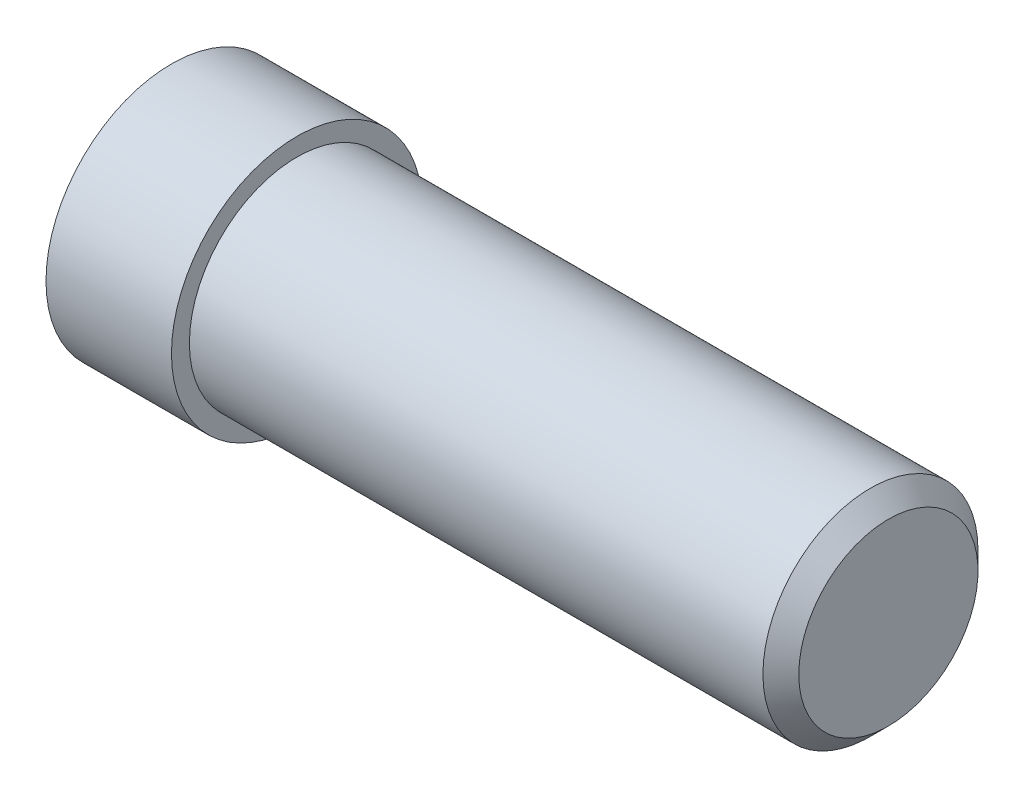
ISO-10303-21;
HEADER;
FILE_DESCRIPTION(('STEP AP214'),'2;1');
FILE_NAME('part.step','',(''),(''),'','','');
FILE_SCHEMA(('AUTOMOTIVE_DESIGN { 1 0 10303 214 1 1 1 1 }'));
ENDSEC;
DATA;
#1=APPLICATION_CONTEXT('core data for automotive mechanical design processes');
#2=APPLICATION_PROTOCOL_DEFINITION('international standard','automotive_design',2000,#1);
#3=PRODUCT_CONTEXT('',#1,'mechanical');
#4=PRODUCT('Part','Part','',(#3));
#5=PRODUCT_RELATED_PRODUCT_CATEGORY('part','',(#4));
#6=PRODUCT_DEFINITION_FORMATION('','',#4);
#7=PRODUCT_DEFINITION_CONTEXT('part definition',#1,'design');
#8=PRODUCT_DEFINITION('design','',#6,#7);
#9=PRODUCT_DEFINITION_SHAPE('','',#8);
#10=(LENGTH_UNIT() NAMED_UNIT(*) SI_UNIT(.MILLI.,.METRE.));
#11=(NAMED_UNIT(*) PLANE_ANGLE_UNIT() SI_UNIT($,.RADIAN.));
#12=(NAMED_UNIT(*) SI_UNIT($,.STERADIAN.) SOLID_ANGLE_UNIT());
#13=UNCERTAINTY_MEASURE_WITH_UNIT(LENGTH_MEASURE(1.E-05),#10,'distance_accuracy_value','');
#14=(GEOMETRIC_REPRESENTATION_CONTEXT(3) GLOBAL_UNCERTAINTY_ASSIGNED_CONTEXT((#13)) GLOBAL_UNIT_ASSIGNED_CONTEXT((#10,
#11,#12)) REPRESENTATION_CONTEXT('',''));
#15=CARTESIAN_POINT('',(0.,0.,0.));
#16=DIRECTION('',(0.,0.,1.));
#17=DIRECTION('',(1.,0.,0.));
#18=AXIS2_PLACEMENT_3D('',#15,#16,#17);
#19=CARTESIAN_POINT('',(-39.0080375692254,25.9128010675254,0.));
#20=DIRECTION('',(-1.,0.,0.));
#21=DIRECTION('',(0.,0.,1.));
#22=AXIS2_PLACEMENT_3D('',#19,#20,#21);
#23=PLANE('',#22);
#24=CARTESIAN_POINT('',(-39.0080375692254,20.1101694915254,0.));
#25=DIRECTION('',(-1.,0.,0.));
#26=DIRECTION('',(0.,0.,1.));
#27=AXIS2_PLACEMENT_3D('',#24,#25,#26);
#28=CIRCLE('',#27,5.802631576);
#29=CARTESIAN_POINT('',(-39.0080375692254,20.1101694915254,5.802631576));
#30=VERTEX_POINT('',#29);
#31=EDGE_CURVE('E51',#30,#30,#28,.T.);
#32=ORIENTED_EDGE('',*,*,#31,.F.);
#33=EDGE_LOOP('',(#32));
#34=FACE_BOUND('',#33,.T.);
#35=CARTESIAN_POINT('',(-39.0080375692254,20.1101694915254,0.));
#36=DIRECTION('',(-1.,0.,0.));
#37=DIRECTION('',(0.,0.,1.));
#38=AXIS2_PLACEMENT_3D('',#35,#36,#37);
#39=CIRCLE('',#38,4.973684208);
#40=CARTESIAN_POINT('',(-39.0080375692254,20.1101694915254,4.973684208));
#41=VERTEX_POINT('',#40);
#42=EDGE_CURVE('E60',#41,#41,#39,.T.);
#43=ORIENTED_EDGE('',*,*,#42,.T.);
#44=EDGE_LOOP('',(#43));
#45=FACE_BOUND('',#44,.T.);
#46=ADVANCED_FACE('F40',(#34,#45),#23,.F.);
#47=CARTESIAN_POINT('',(-45.4991169593271,20.1101694915254,0.));
#48=DIRECTION('',(-1.,0.,0.));
#49=DIRECTION('',(0.,0.,1.));
#50=AXIS2_PLACEMENT_3D('',#47,#48,#49);
#51=CYLINDRICAL_SURFACE('',#50,5.802631576);
#52=CARTESIAN_POINT('',(-44.8106691452254,20.1101694915254,0.));
#53=DIRECTION('',(-1.,0.,0.));
#54=DIRECTION('',(0.,0.,1.));
#55=AXIS2_PLACEMENT_3D('',#52,#53,#54);
#56=CIRCLE('',#55,5.802631576);
#57=CARTESIAN_POINT('',(-44.8106691452254,20.1101694915254,5.802631576));
#58=VERTEX_POINT('',#57);
#59=EDGE_CURVE('E55',#58,#58,#56,.T.);
#60=ORIENTED_EDGE('',*,*,#59,.F.);
#61=EDGE_LOOP('',(#60));
#62=FACE_BOUND('',#61,.T.);
#63=ORIENTED_EDGE('',*,*,#31,.T.);
#64=EDGE_LOOP('',(#63));
#65=FACE_BOUND('',#64,.T.);
#66=ADVANCED_FACE('F77',(#62,#65),#51,.T.);
#67=CARTESIAN_POINT('',(-44.8106691452254,25.9128010675254,0.));
#68=DIRECTION('',(1.,0.,0.));
#69=DIRECTION('',(0.,0.,-1.));
#70=AXIS2_PLACEMENT_3D('',#67,#68,#69);
#71=PLANE('',#70);
#72=ORIENTED_EDGE('',*,*,#59,.T.);
#73=EDGE_LOOP('',(#72));
#74=FACE_BOUND('',#73,.T.);
#75=ADVANCED_FACE('F74',(#74),#71,.F.);
#76=CARTESIAN_POINT('',(-11.6527744252254,25.0838536995254,0.));
#77=DIRECTION('',(-1.,0.,0.));
#78=DIRECTION('',(0.,0.,1.));
#79=AXIS2_PLACEMENT_3D('',#76,#77,#78);
#80=PLANE('',#79);
#81=CARTESIAN_POINT('',(-11.6527744252254,20.1101694915254,0.));
#82=DIRECTION('',(-1.,0.,0.));
#83=DIRECTION('',(0.,0.,1.));
#84=AXIS2_PLACEMENT_3D('',#81,#82,#83);
#85=CIRCLE('',#84,4.14473683999999);
#86=CARTESIAN_POINT('',(-11.6527744252254,20.1101694915254,4.14473683999999));
#87=VERTEX_POINT('',#86);
#88=EDGE_CURVE('E10',#87,#87,#85,.F.);
#89=ORIENTED_EDGE('',*,*,#88,.T.);
#90=EDGE_LOOP('',(#89));
#91=FACE_BOUND('',#90,.T.);
#92=ADVANCED_FACE('F67',(#91),#80,.F.);
#93=CARTESIAN_POINT('',(-45.4991169593271,20.1101694915254,0.));
#94=DIRECTION('',(-1.,0.,0.));
#95=DIRECTION('',(0.,0.,1.));
#96=AXIS2_PLACEMENT_3D('',#93,#94,#95);
#97=CYLINDRICAL_SURFACE('',#96,4.973684208);
#98=CARTESIAN_POINT('',(-12.4817217932254,20.1101694915254,0.));
#99=DIRECTION('',(-1.,0.,0.));
#100=DIRECTION('',(0.,0.,1.));
#101=AXIS2_PLACEMENT_3D('',#98,#99,#100);
#102=CIRCLE('',#101,4.973684208);
#103=CARTESIAN_POINT('',(-12.4817217932254,20.1101694915254,4.973684208));
#104=VERTEX_POINT('',#103);
#105=EDGE_CURVE('E47',#104,#104,#102,.T.);
#106=ORIENTED_EDGE('',*,*,#105,.T.);
#107=EDGE_LOOP('',(#106));
#108=FACE_BOUND('',#107,.T.);
#109=ORIENTED_EDGE('',*,*,#42,.F.);
#110=EDGE_LOOP('',(#109));
#111=FACE_BOUND('',#110,.T.);
#112=ADVANCED_FACE('F65',(#108,#111),#97,.T.);
#113=CARTESIAN_POINT('',(-12.4817217932254,20.1101694915254,0.));
#114=DIRECTION('',(-1.,0.,0.));
#115=DIRECTION('',(0.,0.,1.));
#116=AXIS2_PLACEMENT_3D('',#113,#114,#115);
#117=CONICAL_SURFACE('',#116,4.973684208,0.785398163397453);
#118=ORIENTED_EDGE('',*,*,#88,.F.);
#119=EDGE_LOOP('',(#118));
#120=FACE_BOUND('',#119,.T.);
#121=ORIENTED_EDGE('',*,*,#105,.F.);
#122=EDGE_LOOP('',(#121));
#123=FACE_BOUND('',#122,.T.);
#124=ADVANCED_FACE('F42',(#120,#123),#117,.T.);
#125=CLOSED_SHELL('',(#46,#66,#75,#92,#112,#124));
#126=MANIFOLD_SOLID_BREP('B2',#125);
#127=ADVANCED_BREP_SHAPE_REPRESENTATION('',(#18,#126),#14);
#128=SHAPE_DEFINITION_REPRESENTATION(#9,#127);
ENDSEC;
END-ISO-10303-21;
